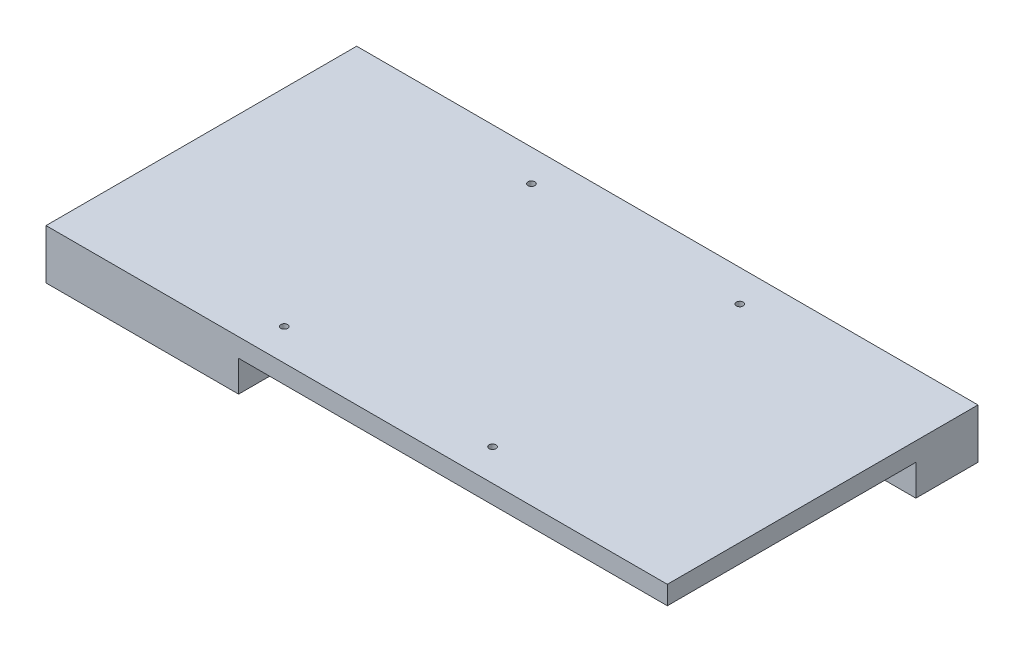
ISO-10303-21;
HEADER;
FILE_DESCRIPTION(('STEP AP214'),'2;1');
FILE_NAME('part.step','',(''),(''),'','','');
FILE_SCHEMA(('AUTOMOTIVE_DESIGN { 1 0 10303 214 1 1 1 1 }'));
ENDSEC;
DATA;
#1=APPLICATION_CONTEXT('core data for automotive mechanical design processes');
#2=APPLICATION_PROTOCOL_DEFINITION('international standard','automotive_design',2000,#1);
#3=PRODUCT_CONTEXT('',#1,'mechanical');
#4=PRODUCT('Part','Part','',(#3));
#5=PRODUCT_RELATED_PRODUCT_CATEGORY('part','',(#4));
#6=PRODUCT_DEFINITION_FORMATION('','',#4);
#7=PRODUCT_DEFINITION_CONTEXT('part definition',#1,'design');
#8=PRODUCT_DEFINITION('design','',#6,#7);
#9=PRODUCT_DEFINITION_SHAPE('','',#8);
#10=(LENGTH_UNIT() NAMED_UNIT(*) SI_UNIT(.MILLI.,.METRE.));
#11=(NAMED_UNIT(*) PLANE_ANGLE_UNIT() SI_UNIT($,.RADIAN.));
#12=(NAMED_UNIT(*) SI_UNIT($,.STERADIAN.) SOLID_ANGLE_UNIT());
#13=UNCERTAINTY_MEASURE_WITH_UNIT(LENGTH_MEASURE(1.E-05),#10,'distance_accuracy_value','');
#14=(GEOMETRIC_REPRESENTATION_CONTEXT(3) GLOBAL_UNCERTAINTY_ASSIGNED_CONTEXT((#13)) GLOBAL_UNIT_ASSIGNED_CONTEXT((#10,
#11,#12)) REPRESENTATION_CONTEXT('',''));
#15=CARTESIAN_POINT('',(0.,0.,0.));
#16=DIRECTION('',(0.,0.,1.));
#17=DIRECTION('',(1.,0.,0.));
#18=AXIS2_PLACEMENT_3D('',#15,#16,#17);
#19=CARTESIAN_POINT('',(0.,0.,0.));
#20=DIRECTION('',(0.,1.,0.));
#21=DIRECTION('',(0.,0.,1.));
#22=AXIS2_PLACEMENT_3D('',#19,#20,#21);
#23=PLANE('',#22);
#24=CARTESIAN_POINT('',(66.465,0.,89.79));
#25=DIRECTION('',(0.,1.,0.));
#26=DIRECTION('',(0.,0.,1.));
#27=AXIS2_PLACEMENT_3D('',#24,#25,#26);
#28=CIRCLE('',#27,1.10000000000001);
#29=CARTESIAN_POINT('',(66.465,0.,90.89));
#30=VERTEX_POINT('',#29);
#31=EDGE_CURVE('E187',#30,#30,#28,.T.);
#32=ORIENTED_EDGE('',*,*,#31,.T.);
#33=EDGE_LOOP('',(#32));
#34=FACE_BOUND('',#33,.T.);
#35=CARTESIAN_POINT('',(133.535,0.,89.79));
#36=DIRECTION('',(0.,1.,0.));
#37=DIRECTION('',(0.,0.,1.));
#38=AXIS2_PLACEMENT_3D('',#35,#36,#37);
#39=CIRCLE('',#38,1.09999999999999);
#40=CARTESIAN_POINT('',(133.535,0.,90.89));
#41=VERTEX_POINT('',#40);
#42=EDGE_CURVE('E188',#41,#41,#39,.T.);
#43=ORIENTED_EDGE('',*,*,#42,.T.);
#44=EDGE_LOOP('',(#43));
#45=FACE_BOUND('',#44,.T.);
#46=CARTESIAN_POINT('',(66.465,0.,10.21));
#47=DIRECTION('',(0.,1.,0.));
#48=DIRECTION('',(0.,0.,1.));
#49=AXIS2_PLACEMENT_3D('',#46,#47,#48);
#50=CIRCLE('',#49,1.10000000000001);
#51=CARTESIAN_POINT('',(66.465,0.,11.31));
#52=VERTEX_POINT('',#51);
#53=EDGE_CURVE('E203',#52,#52,#50,.F.);
#54=ORIENTED_EDGE('',*,*,#53,.F.);
#55=EDGE_LOOP('',(#54));
#56=FACE_BOUND('',#55,.T.);
#57=CARTESIAN_POINT('',(133.535,0.,10.21));
#58=DIRECTION('',(0.,1.,0.));
#59=DIRECTION('',(0.,0.,1.));
#60=AXIS2_PLACEMENT_3D('',#57,#58,#59);
#61=CIRCLE('',#60,1.09999999999999);
#62=CARTESIAN_POINT('',(133.535,0.,11.31));
#63=VERTEX_POINT('',#62);
#64=EDGE_CURVE('E204',#63,#63,#61,.F.);
#65=ORIENTED_EDGE('',*,*,#64,.F.);
#66=EDGE_LOOP('',(#65));
#67=FACE_BOUND('',#66,.T.);
#68=DIRECTION('',(-1.,0.,0.));
#69=VECTOR('',#68,1.);
#70=CARTESIAN_POINT('',(200.,0.,20.));
#71=LINE('',#70,#69);
#72=CARTESIAN_POINT('',(200.,0.,20.));
#73=VERTEX_POINT('',#72);
#74=CARTESIAN_POINT('',(138.,0.,20.));
#75=VERTEX_POINT('',#74);
#76=EDGE_CURVE('E249',#73,#75,#71,.T.);
#77=ORIENTED_EDGE('',*,*,#76,.F.);
#78=DIRECTION('',(0.,0.,-1.));
#79=VECTOR('',#78,1.);
#80=CARTESIAN_POINT('',(200.,0.,0.));
#81=LINE('',#80,#79);
#82=CARTESIAN_POINT('',(200.,0.,100.));
#83=VERTEX_POINT('',#82);
#84=EDGE_CURVE('E142',#83,#73,#81,.T.);
#85=ORIENTED_EDGE('',*,*,#84,.F.);
#86=DIRECTION('',(1.,0.,0.));
#87=VECTOR('',#86,1.);
#88=CARTESIAN_POINT('',(0.,0.,100.));
#89=LINE('',#88,#87);
#90=CARTESIAN_POINT('',(62.,0.,100.));
#91=VERTEX_POINT('',#90);
#92=EDGE_CURVE('E63',#91,#83,#89,.T.);
#93=ORIENTED_EDGE('',*,*,#92,.F.);
#94=DIRECTION('',(0.,0.,1.));
#95=VECTOR('',#94,1.);
#96=CARTESIAN_POINT('',(62.,0.,100.));
#97=LINE('',#96,#95);
#98=CARTESIAN_POINT('',(62.,0.,80.));
#99=VERTEX_POINT('',#98);
#100=EDGE_CURVE('E149',#99,#91,#97,.T.);
#101=ORIENTED_EDGE('',*,*,#100,.F.);
#102=DIRECTION('',(1.,0.,0.));
#103=VECTOR('',#102,1.);
#104=CARTESIAN_POINT('',(0.,0.,80.));
#105=LINE('',#104,#103);
#106=CARTESIAN_POINT('',(0.,0.,80.));
#107=VERTEX_POINT('',#106);
#108=EDGE_CURVE('E144',#107,#99,#105,.T.);
#109=ORIENTED_EDGE('',*,*,#108,.F.);
#110=DIRECTION('',(0.,0.,1.));
#111=VECTOR('',#110,1.);
#112=CARTESIAN_POINT('',(0.,0.,0.));
#113=LINE('',#112,#111);
#114=CARTESIAN_POINT('',(0.,0.,0.));
#115=VERTEX_POINT('',#114);
#116=EDGE_CURVE('E208',#115,#107,#113,.T.);
#117=ORIENTED_EDGE('',*,*,#116,.F.);
#118=DIRECTION('',(-1.,0.,0.));
#119=VECTOR('',#118,1.);
#120=CARTESIAN_POINT('',(0.,0.,0.));
#121=LINE('',#120,#119);
#122=CARTESIAN_POINT('',(138.,0.,0.));
#123=VERTEX_POINT('',#122);
#124=EDGE_CURVE('E220',#123,#115,#121,.T.);
#125=ORIENTED_EDGE('',*,*,#124,.F.);
#126=DIRECTION('',(0.,0.,-1.));
#127=VECTOR('',#126,1.);
#128=CARTESIAN_POINT('',(138.,0.,20.));
#129=LINE('',#128,#127);
#130=EDGE_CURVE('E137',#75,#123,#129,.T.);
#131=ORIENTED_EDGE('',*,*,#130,.F.);
#132=EDGE_LOOP('',(#77,#85,#93,#101,#109,#117,#125,#131));
#133=FACE_BOUND('',#132,.T.);
#134=ADVANCED_FACE('F39',(#34,#45,#56,#67,#133),#23,.F.);
#135=CARTESIAN_POINT('',(0.,6.,0.));
#136=DIRECTION('',(1.,0.,0.));
#137=DIRECTION('',(0.,0.,-1.));
#138=AXIS2_PLACEMENT_3D('',#135,#136,#137);
#139=PLANE('',#138);
#140=ORIENTED_EDGE('',*,*,#116,.T.);
#141=DIRECTION('',(0.,1.,0.));
#142=VECTOR('',#141,1.);
#143=CARTESIAN_POINT('',(0.,-10.,80.));
#144=LINE('',#143,#142);
#145=CARTESIAN_POINT('',(0.,-10.,80.));
#146=VERTEX_POINT('',#145);
#147=EDGE_CURVE('E178',#146,#107,#144,.T.);
#148=ORIENTED_EDGE('',*,*,#147,.F.);
#149=DIRECTION('',(0.,0.,-1.));
#150=VECTOR('',#149,1.);
#151=CARTESIAN_POINT('',(0.,-10.,100.));
#152=LINE('',#151,#150);
#153=CARTESIAN_POINT('',(0.,-10.,100.));
#154=VERTEX_POINT('',#153);
#155=EDGE_CURVE('E154',#154,#146,#152,.T.);
#156=ORIENTED_EDGE('',*,*,#155,.F.);
#157=DIRECTION('',(0.,-1.,0.));
#158=VECTOR('',#157,1.);
#159=CARTESIAN_POINT('',(0.,6.,100.));
#160=LINE('',#159,#158);
#161=CARTESIAN_POINT('',(0.,6.,100.));
#162=VERTEX_POINT('',#161);
#163=EDGE_CURVE('E11',#162,#154,#160,.T.);
#164=ORIENTED_EDGE('',*,*,#163,.F.);
#165=DIRECTION('',(0.,0.,1.));
#166=VECTOR('',#165,1.);
#167=CARTESIAN_POINT('',(0.,6.,0.));
#168=LINE('',#167,#166);
#169=CARTESIAN_POINT('',(0.,6.,0.));
#170=VERTEX_POINT('',#169);
#171=EDGE_CURVE('E215',#170,#162,#168,.T.);
#172=ORIENTED_EDGE('',*,*,#171,.F.);
#173=DIRECTION('',(0.,-1.,0.));
#174=VECTOR('',#173,1.);
#175=CARTESIAN_POINT('',(0.,6.,0.));
#176=LINE('',#175,#174);
#177=EDGE_CURVE('E229',#170,#115,#176,.T.);
#178=ORIENTED_EDGE('',*,*,#177,.T.);
#179=EDGE_LOOP('',(#140,#148,#156,#164,#172,#178));
#180=FACE_BOUND('',#179,.T.);
#181=ADVANCED_FACE('F41',(#180),#139,.F.);
#182=CARTESIAN_POINT('',(0.,6.,100.));
#183=DIRECTION('',(0.,0.,-1.));
#184=DIRECTION('',(-1.,0.,0.));
#185=AXIS2_PLACEMENT_3D('',#182,#183,#184);
#186=PLANE('',#185);
#187=ORIENTED_EDGE('',*,*,#163,.T.);
#188=DIRECTION('',(-1.,0.,0.));
#189=VECTOR('',#188,1.);
#190=CARTESIAN_POINT('',(0.,-10.,100.));
#191=LINE('',#190,#189);
#192=CARTESIAN_POINT('',(62.,-10.,100.));
#193=VERTEX_POINT('',#192);
#194=EDGE_CURVE('E164',#193,#154,#191,.T.);
#195=ORIENTED_EDGE('',*,*,#194,.F.);
#196=DIRECTION('',(0.,1.,0.));
#197=VECTOR('',#196,1.);
#198=CARTESIAN_POINT('',(62.,-10.,100.));
#199=LINE('',#198,#197);
#200=EDGE_CURVE('E167',#193,#91,#199,.T.);
#201=ORIENTED_EDGE('',*,*,#200,.T.);
#202=ORIENTED_EDGE('',*,*,#92,.T.);
#203=DIRECTION('',(0.,-1.,0.));
#204=VECTOR('',#203,1.);
#205=CARTESIAN_POINT('',(200.,6.,100.));
#206=LINE('',#205,#204);
#207=CARTESIAN_POINT('',(200.,6.,100.));
#208=VERTEX_POINT('',#207);
#209=EDGE_CURVE('E48',#208,#83,#206,.T.);
#210=ORIENTED_EDGE('',*,*,#209,.F.);
#211=DIRECTION('',(1.,0.,0.));
#212=VECTOR('',#211,1.);
#213=CARTESIAN_POINT('',(0.,6.,100.));
#214=LINE('',#213,#212);
#215=EDGE_CURVE('E219',#162,#208,#214,.T.);
#216=ORIENTED_EDGE('',*,*,#215,.F.);
#217=EDGE_LOOP('',(#187,#195,#201,#202,#210,#216));
#218=FACE_BOUND('',#217,.T.);
#219=ADVANCED_FACE('F269',(#218),#186,.F.);
#220=CARTESIAN_POINT('',(200.,6.,0.));
#221=DIRECTION('',(-1.,0.,0.));
#222=DIRECTION('',(0.,0.,1.));
#223=AXIS2_PLACEMENT_3D('',#220,#221,#222);
#224=PLANE('',#223);
#225=ORIENTED_EDGE('',*,*,#84,.T.);
#226=DIRECTION('',(0.,1.,0.));
#227=VECTOR('',#226,1.);
#228=CARTESIAN_POINT('',(200.,-10.,20.));
#229=LINE('',#228,#227);
#230=CARTESIAN_POINT('',(200.,-10.,20.));
#231=VERTEX_POINT('',#230);
#232=EDGE_CURVE('E120',#231,#73,#229,.T.);
#233=ORIENTED_EDGE('',*,*,#232,.F.);
#234=DIRECTION('',(0.,0.,1.));
#235=VECTOR('',#234,1.);
#236=CARTESIAN_POINT('',(200.,-10.,20.));
#237=LINE('',#236,#235);
#238=CARTESIAN_POINT('',(200.,-10.,0.));
#239=VERTEX_POINT('',#238);
#240=EDGE_CURVE('E128',#239,#231,#237,.T.);
#241=ORIENTED_EDGE('',*,*,#240,.F.);
#242=DIRECTION('',(0.,-1.,0.));
#243=VECTOR('',#242,1.);
#244=CARTESIAN_POINT('',(200.,6.,0.));
#245=LINE('',#244,#243);
#246=CARTESIAN_POINT('',(200.,6.,0.));
#247=VERTEX_POINT('',#246);
#248=EDGE_CURVE('E242',#247,#239,#245,.T.);
#249=ORIENTED_EDGE('',*,*,#248,.F.);
#250=DIRECTION('',(0.,0.,-1.));
#251=VECTOR('',#250,1.);
#252=CARTESIAN_POINT('',(200.,6.,0.));
#253=LINE('',#252,#251);
#254=EDGE_CURVE('E223',#208,#247,#253,.T.);
#255=ORIENTED_EDGE('',*,*,#254,.F.);
#256=ORIENTED_EDGE('',*,*,#209,.T.);
#257=EDGE_LOOP('',(#225,#233,#241,#249,#255,#256));
#258=FACE_BOUND('',#257,.T.);
#259=ADVANCED_FACE('F140',(#258),#224,.F.);
#260=CARTESIAN_POINT('',(0.,6.,0.));
#261=DIRECTION('',(0.,0.,1.));
#262=DIRECTION('',(1.,0.,0.));
#263=AXIS2_PLACEMENT_3D('',#260,#261,#262);
#264=PLANE('',#263);
#265=ORIENTED_EDGE('',*,*,#248,.T.);
#266=DIRECTION('',(1.,0.,0.));
#267=VECTOR('',#266,1.);
#268=CARTESIAN_POINT('',(200.,-10.,0.));
#269=LINE('',#268,#267);
#270=CARTESIAN_POINT('',(138.,-10.,0.));
#271=VERTEX_POINT('',#270);
#272=EDGE_CURVE('E133',#271,#239,#269,.T.);
#273=ORIENTED_EDGE('',*,*,#272,.F.);
#274=DIRECTION('',(0.,1.,0.));
#275=VECTOR('',#274,1.);
#276=CARTESIAN_POINT('',(138.,-10.,0.));
#277=LINE('',#276,#275);
#278=EDGE_CURVE('E55',#271,#123,#277,.T.);
#279=ORIENTED_EDGE('',*,*,#278,.T.);
#280=ORIENTED_EDGE('',*,*,#124,.T.);
#281=ORIENTED_EDGE('',*,*,#177,.F.);
#282=DIRECTION('',(-1.,0.,0.));
#283=VECTOR('',#282,1.);
#284=CARTESIAN_POINT('',(0.,6.,0.));
#285=LINE('',#284,#283);
#286=EDGE_CURVE('E226',#247,#170,#285,.T.);
#287=ORIENTED_EDGE('',*,*,#286,.F.);
#288=EDGE_LOOP('',(#265,#273,#279,#280,#281,#287));
#289=FACE_BOUND('',#288,.T.);
#290=ADVANCED_FACE('F262',(#289),#264,.F.);
#291=CARTESIAN_POINT('',(0.,6.,0.));
#292=DIRECTION('',(0.,1.,0.));
#293=DIRECTION('',(0.,0.,1.));
#294=AXIS2_PLACEMENT_3D('',#291,#292,#293);
#295=PLANE('',#294);
#296=CARTESIAN_POINT('',(66.465,6.,89.79));
#297=DIRECTION('',(0.,-1.,0.));
#298=DIRECTION('',(0.,0.,-1.));
#299=AXIS2_PLACEMENT_3D('',#296,#297,#298);
#300=CIRCLE('',#299,1.10000000000001);
#301=CARTESIAN_POINT('',(66.465,6.,88.69));
#302=VERTEX_POINT('',#301);
#303=EDGE_CURVE('E183',#302,#302,#300,.T.);
#304=ORIENTED_EDGE('',*,*,#303,.T.);
#305=EDGE_LOOP('',(#304));
#306=FACE_BOUND('',#305,.T.);
#307=CARTESIAN_POINT('',(133.535,6.,89.79));
#308=DIRECTION('',(0.,-1.,0.));
#309=DIRECTION('',(0.,0.,-1.));
#310=AXIS2_PLACEMENT_3D('',#307,#308,#309);
#311=CIRCLE('',#310,1.09999999999999);
#312=CARTESIAN_POINT('',(133.535,6.,88.69));
#313=VERTEX_POINT('',#312);
#314=EDGE_CURVE('E182',#313,#313,#311,.T.);
#315=ORIENTED_EDGE('',*,*,#314,.T.);
#316=EDGE_LOOP('',(#315));
#317=FACE_BOUND('',#316,.T.);
#318=CARTESIAN_POINT('',(66.465,6.,10.21));
#319=DIRECTION('',(0.,1.,0.));
#320=DIRECTION('',(0.,0.,1.));
#321=AXIS2_PLACEMENT_3D('',#318,#319,#320);
#322=CIRCLE('',#321,1.10000000000001);
#323=CARTESIAN_POINT('',(66.465,6.,11.31));
#324=VERTEX_POINT('',#323);
#325=EDGE_CURVE('E199',#324,#324,#322,.T.);
#326=ORIENTED_EDGE('',*,*,#325,.F.);
#327=EDGE_LOOP('',(#326));
#328=FACE_BOUND('',#327,.T.);
#329=CARTESIAN_POINT('',(133.535,6.,10.21));
#330=DIRECTION('',(0.,1.,0.));
#331=DIRECTION('',(0.,0.,1.));
#332=AXIS2_PLACEMENT_3D('',#329,#330,#331);
#333=CIRCLE('',#332,1.09999999999999);
#334=CARTESIAN_POINT('',(133.535,6.,11.31));
#335=VERTEX_POINT('',#334);
#336=EDGE_CURVE('E192',#335,#335,#333,.T.);
#337=ORIENTED_EDGE('',*,*,#336,.F.);
#338=EDGE_LOOP('',(#337));
#339=FACE_BOUND('',#338,.T.);
#340=ORIENTED_EDGE('',*,*,#171,.T.);
#341=ORIENTED_EDGE('',*,*,#215,.T.);
#342=ORIENTED_EDGE('',*,*,#254,.T.);
#343=ORIENTED_EDGE('',*,*,#286,.T.);
#344=EDGE_LOOP('',(#340,#341,#342,#343));
#345=FACE_BOUND('',#344,.T.);
#346=ADVANCED_FACE('F267',(#306,#317,#328,#339,#345),#295,.T.);
#347=CARTESIAN_POINT('',(133.535,-3.11126983722082,10.21));
#348=DIRECTION('',(0.,1.,0.));
#349=DIRECTION('',(0.,0.,1.));
#350=AXIS2_PLACEMENT_3D('',#347,#348,#349);
#351=CYLINDRICAL_SURFACE('',#350,1.09999999999999);
#352=ORIENTED_EDGE('',*,*,#64,.T.);
#353=EDGE_LOOP('',(#352));
#354=FACE_BOUND('',#353,.T.);
#355=ORIENTED_EDGE('',*,*,#336,.T.);
#356=EDGE_LOOP('',(#355));
#357=FACE_BOUND('',#356,.T.);
#358=ADVANCED_FACE('F326',(#354,#357),#351,.F.);
#359=CARTESIAN_POINT('',(66.465,-3.11126983722082,10.21));
#360=DIRECTION('',(0.,1.,0.));
#361=DIRECTION('',(0.,0.,1.));
#362=AXIS2_PLACEMENT_3D('',#359,#360,#361);
#363=CYLINDRICAL_SURFACE('',#362,1.10000000000001);
#364=ORIENTED_EDGE('',*,*,#53,.T.);
#365=EDGE_LOOP('',(#364));
#366=FACE_BOUND('',#365,.T.);
#367=ORIENTED_EDGE('',*,*,#325,.T.);
#368=EDGE_LOOP('',(#367));
#369=FACE_BOUND('',#368,.T.);
#370=ADVANCED_FACE('F335',(#366,#369),#363,.F.);
#371=CARTESIAN_POINT('',(133.535,-3.11126983722082,89.79));
#372=DIRECTION('',(0.,1.,0.));
#373=DIRECTION('',(0.,0.,1.));
#374=AXIS2_PLACEMENT_3D('',#371,#372,#373);
#375=CYLINDRICAL_SURFACE('',#374,1.09999999999999);
#376=ORIENTED_EDGE('',*,*,#42,.F.);
#377=EDGE_LOOP('',(#376));
#378=FACE_BOUND('',#377,.T.);
#379=ORIENTED_EDGE('',*,*,#314,.F.);
#380=EDGE_LOOP('',(#379));
#381=FACE_BOUND('',#380,.T.);
#382=ADVANCED_FACE('F341',(#378,#381),#375,.F.);
#383=CARTESIAN_POINT('',(66.465,-3.11126983722082,89.79));
#384=DIRECTION('',(0.,1.,0.));
#385=DIRECTION('',(0.,0.,1.));
#386=AXIS2_PLACEMENT_3D('',#383,#384,#385);
#387=CYLINDRICAL_SURFACE('',#386,1.10000000000001);
#388=ORIENTED_EDGE('',*,*,#31,.F.);
#389=EDGE_LOOP('',(#388));
#390=FACE_BOUND('',#389,.T.);
#391=ORIENTED_EDGE('',*,*,#303,.F.);
#392=EDGE_LOOP('',(#391));
#393=FACE_BOUND('',#392,.T.);
#394=ADVANCED_FACE('F291',(#390,#393),#387,.F.);
#395=CARTESIAN_POINT('',(0.,-10.,80.));
#396=DIRECTION('',(0.,0.,1.));
#397=DIRECTION('',(1.,0.,0.));
#398=AXIS2_PLACEMENT_3D('',#395,#396,#397);
#399=PLANE('',#398);
#400=ORIENTED_EDGE('',*,*,#108,.T.);
#401=DIRECTION('',(0.,1.,0.));
#402=VECTOR('',#401,1.);
#403=CARTESIAN_POINT('',(62.,-10.,80.));
#404=LINE('',#403,#402);
#405=CARTESIAN_POINT('',(62.,-10.,80.));
#406=VERTEX_POINT('',#405);
#407=EDGE_CURVE('E174',#406,#99,#404,.T.);
#408=ORIENTED_EDGE('',*,*,#407,.F.);
#409=DIRECTION('',(1.,0.,0.));
#410=VECTOR('',#409,1.);
#411=CARTESIAN_POINT('',(0.,-10.,80.));
#412=LINE('',#411,#410);
#413=EDGE_CURVE('E158',#146,#406,#412,.T.);
#414=ORIENTED_EDGE('',*,*,#413,.F.);
#415=ORIENTED_EDGE('',*,*,#147,.T.);
#416=EDGE_LOOP('',(#400,#408,#414,#415));
#417=FACE_BOUND('',#416,.T.);
#418=ADVANCED_FACE('F280',(#417),#399,.F.);
#419=CARTESIAN_POINT('',(62.,-10.,100.));
#420=DIRECTION('',(-1.,0.,0.));
#421=DIRECTION('',(0.,0.,1.));
#422=AXIS2_PLACEMENT_3D('',#419,#420,#421);
#423=PLANE('',#422);
#424=ORIENTED_EDGE('',*,*,#100,.T.);
#425=ORIENTED_EDGE('',*,*,#200,.F.);
#426=DIRECTION('',(0.,0.,1.));
#427=VECTOR('',#426,1.);
#428=CARTESIAN_POINT('',(62.,-10.,100.));
#429=LINE('',#428,#427);
#430=EDGE_CURVE('E161',#406,#193,#429,.T.);
#431=ORIENTED_EDGE('',*,*,#430,.F.);
#432=ORIENTED_EDGE('',*,*,#407,.T.);
#433=EDGE_LOOP('',(#424,#425,#431,#432));
#434=FACE_BOUND('',#433,.T.);
#435=ADVANCED_FACE('F283',(#434),#423,.F.);
#436=CARTESIAN_POINT('',(0.,-10.,0.));
#437=DIRECTION('',(0.,-1.,0.));
#438=DIRECTION('',(0.,0.,-1.));
#439=AXIS2_PLACEMENT_3D('',#436,#437,#438);
#440=PLANE('',#439);
#441=ORIENTED_EDGE('',*,*,#155,.T.);
#442=ORIENTED_EDGE('',*,*,#413,.T.);
#443=ORIENTED_EDGE('',*,*,#430,.T.);
#444=ORIENTED_EDGE('',*,*,#194,.T.);
#445=EDGE_LOOP('',(#441,#442,#443,#444));
#446=FACE_BOUND('',#445,.T.);
#447=ADVANCED_FACE('F274',(#446),#440,.T.);
#448=CARTESIAN_POINT('',(200.,-10.,20.));
#449=DIRECTION('',(0.,0.,-1.));
#450=DIRECTION('',(-1.,0.,0.));
#451=AXIS2_PLACEMENT_3D('',#448,#449,#450);
#452=PLANE('',#451);
#453=ORIENTED_EDGE('',*,*,#76,.T.);
#454=DIRECTION('',(0.,1.,0.));
#455=VECTOR('',#454,1.);
#456=CARTESIAN_POINT('',(138.,-10.,20.));
#457=LINE('',#456,#455);
#458=CARTESIAN_POINT('',(138.,-10.,20.));
#459=VERTEX_POINT('',#458);
#460=EDGE_CURVE('E123',#459,#75,#457,.T.);
#461=ORIENTED_EDGE('',*,*,#460,.F.);
#462=DIRECTION('',(-1.,0.,0.));
#463=VECTOR('',#462,1.);
#464=CARTESIAN_POINT('',(200.,-10.,20.));
#465=LINE('',#464,#463);
#466=EDGE_CURVE('E116',#231,#459,#465,.T.);
#467=ORIENTED_EDGE('',*,*,#466,.F.);
#468=ORIENTED_EDGE('',*,*,#232,.T.);
#469=EDGE_LOOP('',(#453,#461,#467,#468));
#470=FACE_BOUND('',#469,.T.);
#471=ADVANCED_FACE('F118',(#470),#452,.F.);
#472=CARTESIAN_POINT('',(138.,-10.,20.));
#473=DIRECTION('',(1.,0.,0.));
#474=DIRECTION('',(0.,0.,-1.));
#475=AXIS2_PLACEMENT_3D('',#472,#473,#474);
#476=PLANE('',#475);
#477=ORIENTED_EDGE('',*,*,#130,.T.);
#478=ORIENTED_EDGE('',*,*,#278,.F.);
#479=DIRECTION('',(0.,0.,-1.));
#480=VECTOR('',#479,1.);
#481=CARTESIAN_POINT('',(138.,-10.,20.));
#482=LINE('',#481,#480);
#483=EDGE_CURVE('E127',#459,#271,#482,.T.);
#484=ORIENTED_EDGE('',*,*,#483,.F.);
#485=ORIENTED_EDGE('',*,*,#460,.T.);
#486=EDGE_LOOP('',(#477,#478,#484,#485));
#487=FACE_BOUND('',#486,.T.);
#488=ADVANCED_FACE('F261',(#487),#476,.F.);
#489=CARTESIAN_POINT('',(0.,-10.,0.));
#490=DIRECTION('',(0.,1.,0.));
#491=DIRECTION('',(0.,0.,1.));
#492=AXIS2_PLACEMENT_3D('',#489,#490,#491);
#493=PLANE('',#492);
#494=ORIENTED_EDGE('',*,*,#240,.T.);
#495=ORIENTED_EDGE('',*,*,#466,.T.);
#496=ORIENTED_EDGE('',*,*,#483,.T.);
#497=ORIENTED_EDGE('',*,*,#272,.T.);
#498=EDGE_LOOP('',(#494,#495,#496,#497));
#499=FACE_BOUND('',#498,.T.);
#500=ADVANCED_FACE('F132',(#499),#493,.F.);
#501=CLOSED_SHELL('',(#134,#181,#219,#259,#290,#346,#358,#370,#382,#394,#418,#435,#447,#471,
#488,#500));
#502=MANIFOLD_SOLID_BREP('B2',#501);
#503=ADVANCED_BREP_SHAPE_REPRESENTATION('',(#18,#502),#14);
#504=SHAPE_DEFINITION_REPRESENTATION(#9,#503);
ENDSEC;
END-ISO-10303-21;
